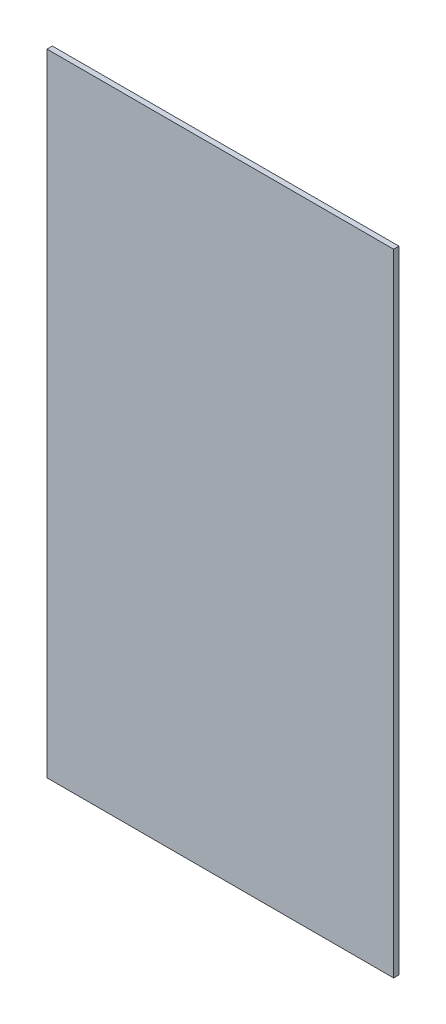
ISO-10303-21;
HEADER;
FILE_DESCRIPTION(('STEP AP214'),'2;1');
FILE_NAME('part.step','',(''),(''),'','','');
FILE_SCHEMA(('AUTOMOTIVE_DESIGN { 1 0 10303 214 1 1 1 1 }'));
ENDSEC;
DATA;
#1=APPLICATION_CONTEXT('core data for automotive mechanical design processes');
#2=APPLICATION_PROTOCOL_DEFINITION('international standard','automotive_design',2000,#1);
#3=PRODUCT_CONTEXT('',#1,'mechanical');
#4=PRODUCT('Part','Part','',(#3));
#5=PRODUCT_RELATED_PRODUCT_CATEGORY('part','',(#4));
#6=PRODUCT_DEFINITION_FORMATION('','',#4);
#7=PRODUCT_DEFINITION_CONTEXT('part definition',#1,'design');
#8=PRODUCT_DEFINITION('design','',#6,#7);
#9=PRODUCT_DEFINITION_SHAPE('','',#8);
#10=(LENGTH_UNIT() NAMED_UNIT(*) SI_UNIT(.MILLI.,.METRE.));
#11=(NAMED_UNIT(*) PLANE_ANGLE_UNIT() SI_UNIT($,.RADIAN.));
#12=(NAMED_UNIT(*) SI_UNIT($,.STERADIAN.) SOLID_ANGLE_UNIT());
#13=UNCERTAINTY_MEASURE_WITH_UNIT(LENGTH_MEASURE(1.E-05),#10,'distance_accuracy_value','');
#14=(GEOMETRIC_REPRESENTATION_CONTEXT(3) GLOBAL_UNCERTAINTY_ASSIGNED_CONTEXT((#13)) GLOBAL_UNIT_ASSIGNED_CONTEXT((#10,
#11,#12)) REPRESENTATION_CONTEXT('',''));
#15=CARTESIAN_POINT('',(0.,0.,0.));
#16=DIRECTION('',(0.,0.,1.));
#17=DIRECTION('',(1.,0.,0.));
#18=AXIS2_PLACEMENT_3D('',#15,#16,#17);
#19=CARTESIAN_POINT('',(97.5,177.5,3.));
#20=DIRECTION('',(-1.,0.,0.));
#21=DIRECTION('',(0.,-1.,0.));
#22=AXIS2_PLACEMENT_3D('',#19,#20,#21);
#23=PLANE('',#22);
#24=DIRECTION('',(0.,1.,0.));
#25=VECTOR('',#24,1.);
#26=CARTESIAN_POINT('',(97.5,177.5,0.));
#27=LINE('',#26,#25);
#28=CARTESIAN_POINT('',(97.5,-177.5,0.));
#29=VERTEX_POINT('',#28);
#30=CARTESIAN_POINT('',(97.5,177.5,0.));
#31=VERTEX_POINT('',#30);
#32=EDGE_CURVE('E96',#29,#31,#27,.T.);
#33=ORIENTED_EDGE('',*,*,#32,.T.);
#34=DIRECTION('',(0.,0.,-1.));
#35=VECTOR('',#34,1.);
#36=CARTESIAN_POINT('',(97.5,177.5,3.));
#37=LINE('',#36,#35);
#38=CARTESIAN_POINT('',(97.5,177.5,3.));
#39=VERTEX_POINT('',#38);
#40=EDGE_CURVE('E11',#39,#31,#37,.T.);
#41=ORIENTED_EDGE('',*,*,#40,.F.);
#42=DIRECTION('',(0.,1.,0.));
#43=VECTOR('',#42,1.);
#44=CARTESIAN_POINT('',(97.5,177.5,3.));
#45=LINE('',#44,#43);
#46=CARTESIAN_POINT('',(97.5,-177.5,3.));
#47=VERTEX_POINT('',#46);
#48=EDGE_CURVE('E84',#47,#39,#45,.T.);
#49=ORIENTED_EDGE('',*,*,#48,.F.);
#50=DIRECTION('',(0.,0.,-1.));
#51=VECTOR('',#50,1.);
#52=CARTESIAN_POINT('',(97.5,-177.5,3.));
#53=LINE('',#52,#51);
#54=EDGE_CURVE('E92',#47,#29,#53,.T.);
#55=ORIENTED_EDGE('',*,*,#54,.T.);
#56=EDGE_LOOP('',(#33,#41,#49,#55));
#57=FACE_BOUND('',#56,.T.);
#58=ADVANCED_FACE('F33',(#57),#23,.F.);
#59=CARTESIAN_POINT('',(-97.5,177.5,3.));
#60=DIRECTION('',(0.,-1.,0.));
#61=DIRECTION('',(0.,0.,-1.));
#62=AXIS2_PLACEMENT_3D('',#59,#60,#61);
#63=PLANE('',#62);
#64=DIRECTION('',(-1.,0.,0.));
#65=VECTOR('',#64,1.);
#66=CARTESIAN_POINT('',(-97.5,177.5,0.));
#67=LINE('',#66,#65);
#68=CARTESIAN_POINT('',(-97.5,177.5,0.));
#69=VERTEX_POINT('',#68);
#70=EDGE_CURVE('E88',#31,#69,#67,.T.);
#71=ORIENTED_EDGE('',*,*,#70,.T.);
#72=DIRECTION('',(0.,0.,-1.));
#73=VECTOR('',#72,1.);
#74=CARTESIAN_POINT('',(-97.5,177.5,3.));
#75=LINE('',#74,#73);
#76=CARTESIAN_POINT('',(-97.5,177.5,3.));
#77=VERTEX_POINT('',#76);
#78=EDGE_CURVE('E41',#77,#69,#75,.T.);
#79=ORIENTED_EDGE('',*,*,#78,.F.);
#80=DIRECTION('',(-1.,0.,0.));
#81=VECTOR('',#80,1.);
#82=CARTESIAN_POINT('',(-97.5,177.5,3.));
#83=LINE('',#82,#81);
#84=EDGE_CURVE('E79',#39,#77,#83,.T.);
#85=ORIENTED_EDGE('',*,*,#84,.F.);
#86=ORIENTED_EDGE('',*,*,#40,.T.);
#87=EDGE_LOOP('',(#71,#79,#85,#86));
#88=FACE_BOUND('',#87,.T.);
#89=ADVANCED_FACE('F87',(#88),#63,.F.);
#90=CARTESIAN_POINT('',(-97.5,177.5,3.));
#91=DIRECTION('',(1.,0.,0.));
#92=DIRECTION('',(0.,1.,0.));
#93=AXIS2_PLACEMENT_3D('',#90,#91,#92);
#94=PLANE('',#93);
#95=DIRECTION('',(0.,-1.,0.));
#96=VECTOR('',#95,1.);
#97=CARTESIAN_POINT('',(-97.5,177.5,0.));
#98=LINE('',#97,#96);
#99=CARTESIAN_POINT('',(-97.5,-177.5,0.));
#100=VERTEX_POINT('',#99);
#101=EDGE_CURVE('E66',#69,#100,#98,.T.);
#102=ORIENTED_EDGE('',*,*,#101,.T.);
#103=DIRECTION('',(0.,0.,-1.));
#104=VECTOR('',#103,1.);
#105=CARTESIAN_POINT('',(-97.5,-177.5,3.));
#106=LINE('',#105,#104);
#107=CARTESIAN_POINT('',(-97.5,-177.5,3.));
#108=VERTEX_POINT('',#107);
#109=EDGE_CURVE('E89',#108,#100,#106,.T.);
#110=ORIENTED_EDGE('',*,*,#109,.F.);
#111=DIRECTION('',(0.,-1.,0.));
#112=VECTOR('',#111,1.);
#113=CARTESIAN_POINT('',(-97.5,177.5,3.));
#114=LINE('',#113,#112);
#115=EDGE_CURVE('E82',#77,#108,#114,.T.);
#116=ORIENTED_EDGE('',*,*,#115,.F.);
#117=ORIENTED_EDGE('',*,*,#78,.T.);
#118=EDGE_LOOP('',(#102,#110,#116,#117));
#119=FACE_BOUND('',#118,.T.);
#120=ADVANCED_FACE('F90',(#119),#94,.F.);
#121=CARTESIAN_POINT('',(-97.5,-177.5,3.));
#122=DIRECTION('',(0.,1.,0.));
#123=DIRECTION('',(0.,0.,1.));
#124=AXIS2_PLACEMENT_3D('',#121,#122,#123);
#125=PLANE('',#124);
#126=DIRECTION('',(1.,0.,0.));
#127=VECTOR('',#126,1.);
#128=CARTESIAN_POINT('',(-97.5,-177.5,0.));
#129=LINE('',#128,#127);
#130=EDGE_CURVE('E72',#100,#29,#129,.T.);
#131=ORIENTED_EDGE('',*,*,#130,.T.);
#132=ORIENTED_EDGE('',*,*,#54,.F.);
#133=DIRECTION('',(1.,0.,0.));
#134=VECTOR('',#133,1.);
#135=CARTESIAN_POINT('',(-97.5,-177.5,3.));
#136=LINE('',#135,#134);
#137=EDGE_CURVE('E49',#108,#47,#136,.T.);
#138=ORIENTED_EDGE('',*,*,#137,.F.);
#139=ORIENTED_EDGE('',*,*,#109,.T.);
#140=EDGE_LOOP('',(#131,#132,#138,#139));
#141=FACE_BOUND('',#140,.T.);
#142=ADVANCED_FACE('F103',(#141),#125,.F.);
#143=CARTESIAN_POINT('',(0.,0.,3.));
#144=DIRECTION('',(0.,0.,1.));
#145=DIRECTION('',(1.,0.,0.));
#146=AXIS2_PLACEMENT_3D('',#143,#144,#145);
#147=PLANE('',#146);
#148=ORIENTED_EDGE('',*,*,#48,.T.);
#149=ORIENTED_EDGE('',*,*,#84,.T.);
#150=ORIENTED_EDGE('',*,*,#115,.T.);
#151=ORIENTED_EDGE('',*,*,#137,.T.);
#152=EDGE_LOOP('',(#148,#149,#150,#151));
#153=FACE_BOUND('',#152,.T.);
#154=ADVANCED_FACE('F80',(#153),#147,.T.);
#155=CARTESIAN_POINT('',(0.,0.,0.));
#156=DIRECTION('',(0.,0.,1.));
#157=DIRECTION('',(1.,0.,0.));
#158=AXIS2_PLACEMENT_3D('',#155,#156,#157);
#159=PLANE('',#158);
#160=ORIENTED_EDGE('',*,*,#32,.F.);
#161=ORIENTED_EDGE('',*,*,#130,.F.);
#162=ORIENTED_EDGE('',*,*,#101,.F.);
#163=ORIENTED_EDGE('',*,*,#70,.F.);
#164=EDGE_LOOP('',(#160,#161,#162,#163));
#165=FACE_BOUND('',#164,.T.);
#166=ADVANCED_FACE('F106',(#165),#159,.F.);
#167=CLOSED_SHELL('',(#58,#89,#120,#142,#154,#166));
#168=MANIFOLD_SOLID_BREP('B2',#167);
#169=ADVANCED_BREP_SHAPE_REPRESENTATION('',(#18,#168),#14);
#170=SHAPE_DEFINITION_REPRESENTATION(#9,#169);
ENDSEC;
END-ISO-10303-21;
